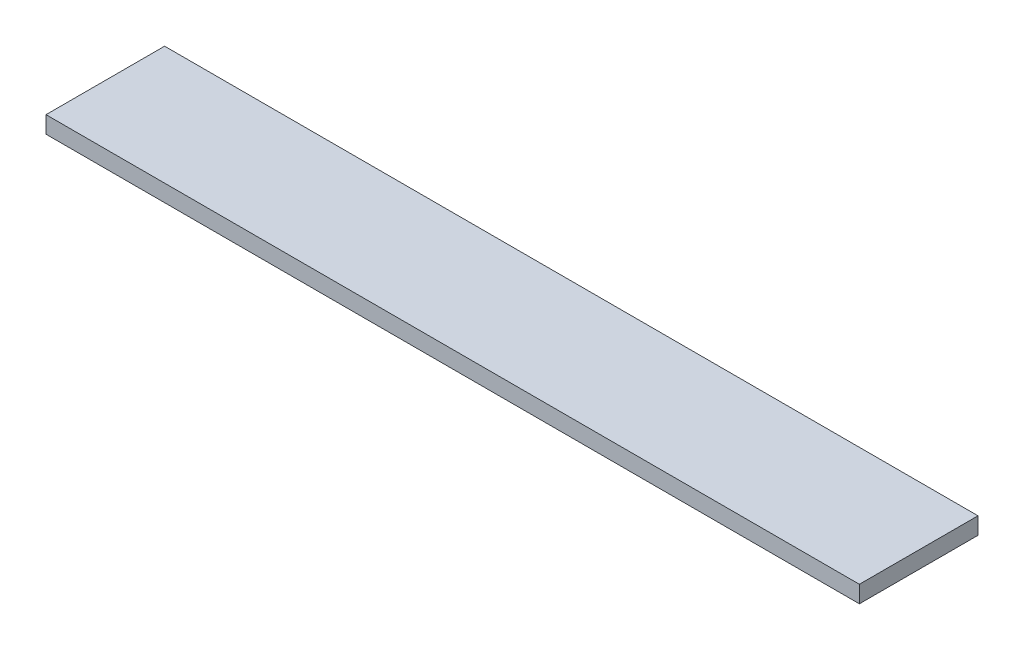
ISO-10303-21;
HEADER;
FILE_DESCRIPTION(('STEP AP214'),'2;1');
FILE_NAME('part.step','',(''),(''),'','','');
FILE_SCHEMA(('AUTOMOTIVE_DESIGN { 1 0 10303 214 1 1 1 1 }'));
ENDSEC;
DATA;
#1=APPLICATION_CONTEXT('core data for automotive mechanical design processes');
#2=APPLICATION_PROTOCOL_DEFINITION('international standard','automotive_design',2000,#1);
#3=PRODUCT_CONTEXT('',#1,'mechanical');
#4=PRODUCT('Part','Part','',(#3));
#5=PRODUCT_RELATED_PRODUCT_CATEGORY('part','',(#4));
#6=PRODUCT_DEFINITION_FORMATION('','',#4);
#7=PRODUCT_DEFINITION_CONTEXT('part definition',#1,'design');
#8=PRODUCT_DEFINITION('design','',#6,#7);
#9=PRODUCT_DEFINITION_SHAPE('','',#8);
#10=(LENGTH_UNIT() NAMED_UNIT(*) SI_UNIT(.MILLI.,.METRE.));
#11=(NAMED_UNIT(*) PLANE_ANGLE_UNIT() SI_UNIT($,.RADIAN.));
#12=(NAMED_UNIT(*) SI_UNIT($,.STERADIAN.) SOLID_ANGLE_UNIT());
#13=UNCERTAINTY_MEASURE_WITH_UNIT(LENGTH_MEASURE(1.E-05),#10,'distance_accuracy_value','');
#14=(GEOMETRIC_REPRESENTATION_CONTEXT(3) GLOBAL_UNCERTAINTY_ASSIGNED_CONTEXT((#13)) GLOBAL_UNIT_ASSIGNED_CONTEXT((#10,
#11,#12)) REPRESENTATION_CONTEXT('',''));
#15=CARTESIAN_POINT('',(0.,0.,0.));
#16=DIRECTION('',(0.,0.,1.));
#17=DIRECTION('',(1.,0.,0.));
#18=AXIS2_PLACEMENT_3D('',#15,#16,#17);
#19=CARTESIAN_POINT('',(304.8,-12.7,88.9));
#20=DIRECTION('',(1.,0.,0.));
#21=DIRECTION('',(0.,0.,-1.));
#22=AXIS2_PLACEMENT_3D('',#19,#20,#21);
#23=PLANE('',#22);
#24=DIRECTION('',(0.,0.,-1.));
#25=VECTOR('',#24,1.);
#26=CARTESIAN_POINT('',(304.8,0.,88.9));
#27=LINE('',#26,#25);
#28=CARTESIAN_POINT('',(304.8,0.,88.9));
#29=VERTEX_POINT('',#28);
#30=CARTESIAN_POINT('',(304.8,0.,0.));
#31=VERTEX_POINT('',#30);
#32=EDGE_CURVE('E93',#29,#31,#27,.T.);
#33=ORIENTED_EDGE('',*,*,#32,.F.);
#34=DIRECTION('',(0.,1.,0.));
#35=VECTOR('',#34,1.);
#36=CARTESIAN_POINT('',(304.8,-12.7,88.9));
#37=LINE('',#36,#35);
#38=CARTESIAN_POINT('',(304.8,-12.7,88.9));
#39=VERTEX_POINT('',#38);
#40=EDGE_CURVE('E11',#39,#29,#37,.T.);
#41=ORIENTED_EDGE('',*,*,#40,.F.);
#42=DIRECTION('',(0.,0.,-1.));
#43=VECTOR('',#42,1.);
#44=CARTESIAN_POINT('',(304.8,-12.7,88.9));
#45=LINE('',#44,#43);
#46=CARTESIAN_POINT('',(304.8,-12.7,0.));
#47=VERTEX_POINT('',#46);
#48=EDGE_CURVE('E87',#39,#47,#45,.T.);
#49=ORIENTED_EDGE('',*,*,#48,.T.);
#50=DIRECTION('',(0.,1.,0.));
#51=VECTOR('',#50,1.);
#52=CARTESIAN_POINT('',(304.8,-12.7,0.));
#53=LINE('',#52,#51);
#54=EDGE_CURVE('E32',#47,#31,#53,.T.);
#55=ORIENTED_EDGE('',*,*,#54,.T.);
#56=EDGE_LOOP('',(#33,#41,#49,#55));
#57=FACE_BOUND('',#56,.T.);
#58=ADVANCED_FACE('F29',(#57),#23,.T.);
#59=CARTESIAN_POINT('',(-304.8,-12.7,88.9));
#60=DIRECTION('',(0.,0.,1.));
#61=DIRECTION('',(1.,0.,0.));
#62=AXIS2_PLACEMENT_3D('',#59,#60,#61);
#63=PLANE('',#62);
#64=DIRECTION('',(1.,0.,0.));
#65=VECTOR('',#64,1.);
#66=CARTESIAN_POINT('',(-304.8,0.,88.9));
#67=LINE('',#66,#65);
#68=CARTESIAN_POINT('',(-304.8,0.,88.9));
#69=VERTEX_POINT('',#68);
#70=EDGE_CURVE('E89',#69,#29,#67,.T.);
#71=ORIENTED_EDGE('',*,*,#70,.F.);
#72=DIRECTION('',(0.,1.,0.));
#73=VECTOR('',#72,1.);
#74=CARTESIAN_POINT('',(-304.8,-12.7,88.9));
#75=LINE('',#74,#73);
#76=CARTESIAN_POINT('',(-304.8,-12.7,88.9));
#77=VERTEX_POINT('',#76);
#78=EDGE_CURVE('E38',#77,#69,#75,.T.);
#79=ORIENTED_EDGE('',*,*,#78,.F.);
#80=DIRECTION('',(1.,0.,0.));
#81=VECTOR('',#80,1.);
#82=CARTESIAN_POINT('',(-304.8,-12.7,88.9));
#83=LINE('',#82,#81);
#84=EDGE_CURVE('E84',#77,#39,#83,.T.);
#85=ORIENTED_EDGE('',*,*,#84,.T.);
#86=ORIENTED_EDGE('',*,*,#40,.T.);
#87=EDGE_LOOP('',(#71,#79,#85,#86));
#88=FACE_BOUND('',#87,.T.);
#89=ADVANCED_FACE('F103',(#88),#63,.T.);
#90=CARTESIAN_POINT('',(-304.8,-12.7,88.9));
#91=DIRECTION('',(-1.,0.,0.));
#92=DIRECTION('',(0.,0.,1.));
#93=AXIS2_PLACEMENT_3D('',#90,#91,#92);
#94=PLANE('',#93);
#95=DIRECTION('',(0.,0.,1.));
#96=VECTOR('',#95,1.);
#97=CARTESIAN_POINT('',(-304.8,0.,88.9));
#98=LINE('',#97,#96);
#99=CARTESIAN_POINT('',(-304.8,0.,0.));
#100=VERTEX_POINT('',#99);
#101=EDGE_CURVE('E79',#100,#69,#98,.T.);
#102=ORIENTED_EDGE('',*,*,#101,.F.);
#103=DIRECTION('',(0.,1.,0.));
#104=VECTOR('',#103,1.);
#105=CARTESIAN_POINT('',(-304.8,-12.7,0.));
#106=LINE('',#105,#104);
#107=CARTESIAN_POINT('',(-304.8,-12.7,0.));
#108=VERTEX_POINT('',#107);
#109=EDGE_CURVE('E74',#108,#100,#106,.T.);
#110=ORIENTED_EDGE('',*,*,#109,.F.);
#111=DIRECTION('',(0.,0.,1.));
#112=VECTOR('',#111,1.);
#113=CARTESIAN_POINT('',(-304.8,-12.7,88.9));
#114=LINE('',#113,#112);
#115=EDGE_CURVE('E77',#108,#77,#114,.T.);
#116=ORIENTED_EDGE('',*,*,#115,.T.);
#117=ORIENTED_EDGE('',*,*,#78,.T.);
#118=EDGE_LOOP('',(#102,#110,#116,#117));
#119=FACE_BOUND('',#118,.T.);
#120=ADVANCED_FACE('F76',(#119),#94,.T.);
#121=CARTESIAN_POINT('',(-304.8,-12.7,0.));
#122=DIRECTION('',(0.,0.,-1.));
#123=DIRECTION('',(-1.,0.,0.));
#124=AXIS2_PLACEMENT_3D('',#121,#122,#123);
#125=PLANE('',#124);
#126=DIRECTION('',(-1.,0.,0.));
#127=VECTOR('',#126,1.);
#128=CARTESIAN_POINT('',(-304.8,0.,0.));
#129=LINE('',#128,#127);
#130=EDGE_CURVE('E96',#31,#100,#129,.T.);
#131=ORIENTED_EDGE('',*,*,#130,.F.);
#132=ORIENTED_EDGE('',*,*,#54,.F.);
#133=DIRECTION('',(-1.,0.,0.));
#134=VECTOR('',#133,1.);
#135=CARTESIAN_POINT('',(-304.8,-12.7,0.));
#136=LINE('',#135,#134);
#137=EDGE_CURVE('E83',#47,#108,#136,.T.);
#138=ORIENTED_EDGE('',*,*,#137,.T.);
#139=ORIENTED_EDGE('',*,*,#109,.T.);
#140=EDGE_LOOP('',(#131,#132,#138,#139));
#141=FACE_BOUND('',#140,.T.);
#142=ADVANCED_FACE('F86',(#141),#125,.T.);
#143=CARTESIAN_POINT('',(0.,-12.7,0.));
#144=DIRECTION('',(0.,-1.,0.));
#145=DIRECTION('',(0.,0.,-1.));
#146=AXIS2_PLACEMENT_3D('',#143,#144,#145);
#147=PLANE('',#146);
#148=ORIENTED_EDGE('',*,*,#48,.F.);
#149=ORIENTED_EDGE('',*,*,#84,.F.);
#150=ORIENTED_EDGE('',*,*,#115,.F.);
#151=ORIENTED_EDGE('',*,*,#137,.F.);
#152=EDGE_LOOP('',(#148,#149,#150,#151));
#153=FACE_BOUND('',#152,.T.);
#154=ADVANCED_FACE('F82',(#153),#147,.T.);
#155=CARTESIAN_POINT('',(0.,0.,0.));
#156=DIRECTION('',(0.,-1.,0.));
#157=DIRECTION('',(0.,0.,-1.));
#158=AXIS2_PLACEMENT_3D('',#155,#156,#157);
#159=PLANE('',#158);
#160=ORIENTED_EDGE('',*,*,#32,.T.);
#161=ORIENTED_EDGE('',*,*,#130,.T.);
#162=ORIENTED_EDGE('',*,*,#101,.T.);
#163=ORIENTED_EDGE('',*,*,#70,.T.);
#164=EDGE_LOOP('',(#160,#161,#162,#163));
#165=FACE_BOUND('',#164,.T.);
#166=ADVANCED_FACE('F102',(#165),#159,.F.);
#167=CLOSED_SHELL('',(#58,#89,#120,#142,#154,#166));
#168=MANIFOLD_SOLID_BREP('B2',#167);
#169=ADVANCED_BREP_SHAPE_REPRESENTATION('',(#18,#168),#14);
#170=SHAPE_DEFINITION_REPRESENTATION(#9,#169);
ENDSEC;
END-ISO-10303-21;
